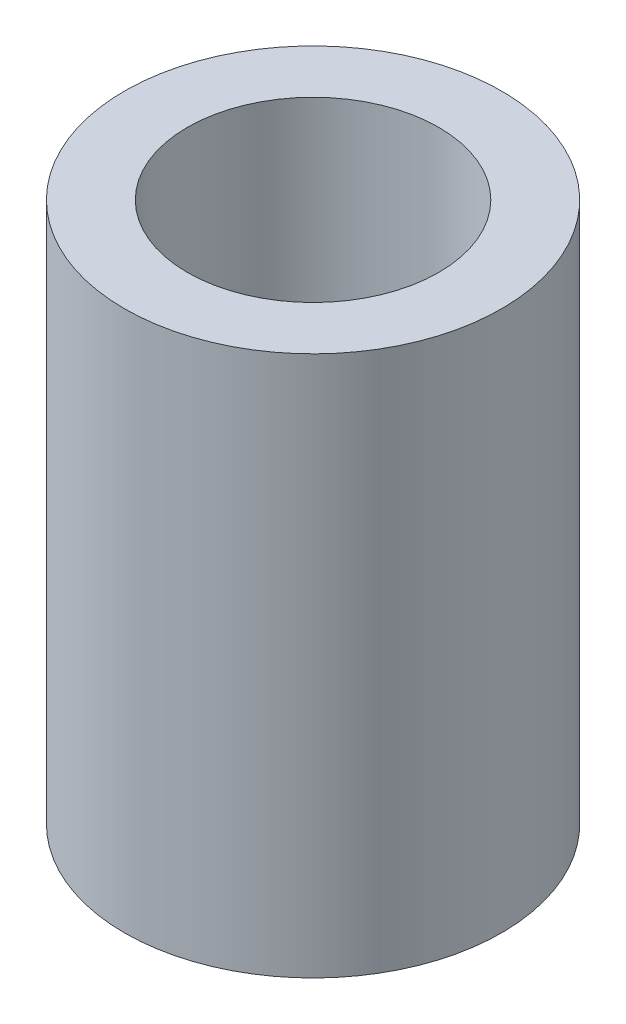
ISO-10303-21;
HEADER;
FILE_DESCRIPTION(('STEP AP214'),'2;1');
FILE_NAME('part.step','',(''),(''),'','','');
FILE_SCHEMA(('AUTOMOTIVE_DESIGN { 1 0 10303 214 1 1 1 1 }'));
ENDSEC;
DATA;
#1=APPLICATION_CONTEXT('core data for automotive mechanical design processes');
#2=APPLICATION_PROTOCOL_DEFINITION('international standard','automotive_design',2000,#1);
#3=PRODUCT_CONTEXT('',#1,'mechanical');
#4=PRODUCT('Part','Part','',(#3));
#5=PRODUCT_RELATED_PRODUCT_CATEGORY('part','',(#4));
#6=PRODUCT_DEFINITION_FORMATION('','',#4);
#7=PRODUCT_DEFINITION_CONTEXT('part definition',#1,'design');
#8=PRODUCT_DEFINITION('design','',#6,#7);
#9=PRODUCT_DEFINITION_SHAPE('','',#8);
#10=(LENGTH_UNIT() NAMED_UNIT(*) SI_UNIT(.MILLI.,.METRE.));
#11=(NAMED_UNIT(*) PLANE_ANGLE_UNIT() SI_UNIT($,.RADIAN.));
#12=(NAMED_UNIT(*) SI_UNIT($,.STERADIAN.) SOLID_ANGLE_UNIT());
#13=UNCERTAINTY_MEASURE_WITH_UNIT(LENGTH_MEASURE(1.E-05),#10,'distance_accuracy_value','');
#14=(GEOMETRIC_REPRESENTATION_CONTEXT(3) GLOBAL_UNCERTAINTY_ASSIGNED_CONTEXT((#13)) GLOBAL_UNIT_ASSIGNED_CONTEXT((#10,
#11,#12)) REPRESENTATION_CONTEXT('',''));
#15=CARTESIAN_POINT('',(0.,0.,0.));
#16=DIRECTION('',(0.,0.,1.));
#17=DIRECTION('',(1.,0.,0.));
#18=AXIS2_PLACEMENT_3D('',#15,#16,#17);
#19=CARTESIAN_POINT('',(0.,21.5,0.));
#20=DIRECTION('',(0.,1.,0.));
#21=DIRECTION('',(0.,0.,1.));
#22=AXIS2_PLACEMENT_3D('',#19,#20,#21);
#23=PLANE('',#22);
#24=CARTESIAN_POINT('',(0.,21.5,0.));
#25=DIRECTION('',(0.,1.,0.));
#26=DIRECTION('',(0.,0.,1.));
#27=AXIS2_PLACEMENT_3D('',#24,#25,#26);
#28=CIRCLE('',#27,7.5);
#29=CARTESIAN_POINT('',(0.,21.5,7.5));
#30=VERTEX_POINT('',#29);
#31=EDGE_CURVE('E10',#30,#30,#28,.T.);
#32=ORIENTED_EDGE('',*,*,#31,.T.);
#33=EDGE_LOOP('',(#32));
#34=FACE_BOUND('',#33,.T.);
#35=CARTESIAN_POINT('',(0.,21.5,0.));
#36=DIRECTION('',(0.,1.,0.));
#37=DIRECTION('',(0.,0.,1.));
#38=AXIS2_PLACEMENT_3D('',#35,#36,#37);
#39=CIRCLE('',#38,5.);
#40=CARTESIAN_POINT('',(0.,21.5,5.));
#41=VERTEX_POINT('',#40);
#42=EDGE_CURVE('E50',#41,#41,#39,.T.);
#43=ORIENTED_EDGE('',*,*,#42,.F.);
#44=EDGE_LOOP('',(#43));
#45=FACE_BOUND('',#44,.T.);
#46=ADVANCED_FACE('F37',(#34,#45),#23,.T.);
#47=CARTESIAN_POINT('',(0.,0.,0.));
#48=DIRECTION('',(0.,1.,0.));
#49=DIRECTION('',(0.,0.,1.));
#50=AXIS2_PLACEMENT_3D('',#47,#48,#49);
#51=PLANE('',#50);
#52=CARTESIAN_POINT('',(0.,0.,0.));
#53=DIRECTION('',(0.,1.,0.));
#54=DIRECTION('',(0.,0.,1.));
#55=AXIS2_PLACEMENT_3D('',#52,#53,#54);
#56=CIRCLE('',#55,7.5);
#57=CARTESIAN_POINT('',(0.,0.,7.5));
#58=VERTEX_POINT('',#57);
#59=EDGE_CURVE('E41',#58,#58,#56,.T.);
#60=ORIENTED_EDGE('',*,*,#59,.F.);
#61=EDGE_LOOP('',(#60));
#62=FACE_BOUND('',#61,.T.);
#63=CARTESIAN_POINT('',(0.,0.,0.));
#64=DIRECTION('',(0.,1.,0.));
#65=DIRECTION('',(0.,0.,1.));
#66=AXIS2_PLACEMENT_3D('',#63,#64,#65);
#67=CIRCLE('',#66,5.);
#68=CARTESIAN_POINT('',(0.,0.,5.));
#69=VERTEX_POINT('',#68);
#70=EDGE_CURVE('E52',#69,#69,#67,.T.);
#71=ORIENTED_EDGE('',*,*,#70,.T.);
#72=EDGE_LOOP('',(#71));
#73=FACE_BOUND('',#72,.T.);
#74=ADVANCED_FACE('F64',(#62,#73),#51,.F.);
#75=CARTESIAN_POINT('',(0.,21.5,0.));
#76=DIRECTION('',(0.,-1.,0.));
#77=DIRECTION('',(0.,0.,-1.));
#78=AXIS2_PLACEMENT_3D('',#75,#76,#77);
#79=CYLINDRICAL_SURFACE('',#78,7.5);
#80=ORIENTED_EDGE('',*,*,#31,.F.);
#81=EDGE_LOOP('',(#80));
#82=FACE_BOUND('',#81,.T.);
#83=ORIENTED_EDGE('',*,*,#59,.T.);
#84=EDGE_LOOP('',(#83));
#85=FACE_BOUND('',#84,.T.);
#86=ADVANCED_FACE('F39',(#82,#85),#79,.T.);
#87=CARTESIAN_POINT('',(0.,21.5,0.));
#88=DIRECTION('',(0.,-1.,0.));
#89=DIRECTION('',(0.,0.,-1.));
#90=AXIS2_PLACEMENT_3D('',#87,#88,#89);
#91=CYLINDRICAL_SURFACE('',#90,5.);
#92=ORIENTED_EDGE('',*,*,#42,.T.);
#93=EDGE_LOOP('',(#92));
#94=FACE_BOUND('',#93,.T.);
#95=ORIENTED_EDGE('',*,*,#70,.F.);
#96=EDGE_LOOP('',(#95));
#97=FACE_BOUND('',#96,.T.);
#98=ADVANCED_FACE('F60',(#94,#97),#91,.F.);
#99=CLOSED_SHELL('',(#46,#74,#86,#98));
#100=MANIFOLD_SOLID_BREP('B2',#99);
#101=ADVANCED_BREP_SHAPE_REPRESENTATION('',(#18,#100),#14);
#102=SHAPE_DEFINITION_REPRESENTATION(#9,#101);
ENDSEC;
END-ISO-10303-21;
